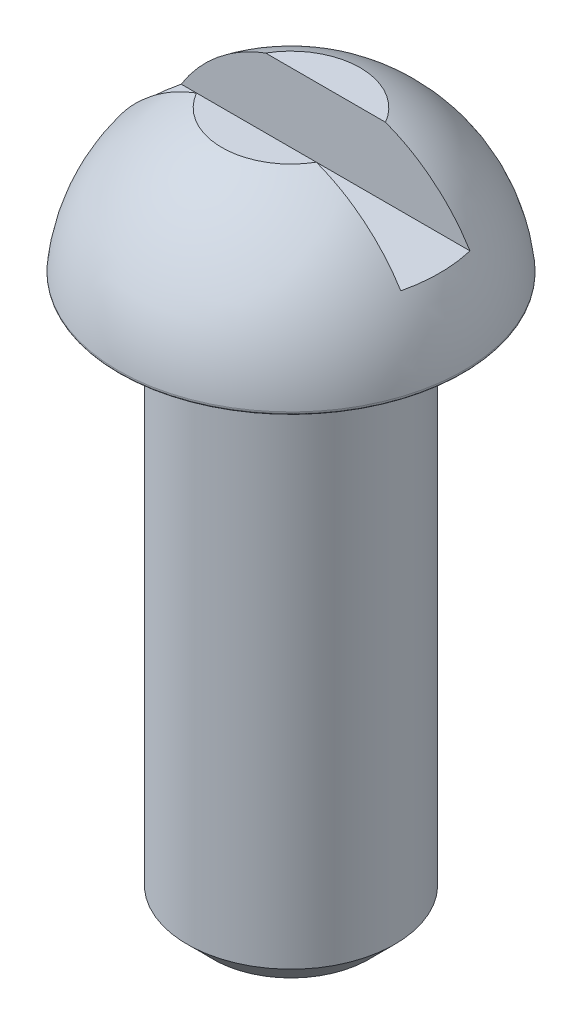
ISO-10303-21;
HEADER;
FILE_DESCRIPTION(('STEP AP214'),'2;1');
FILE_NAME('part.step','',(''),(''),'','','');
FILE_SCHEMA(('AUTOMOTIVE_DESIGN { 1 0 10303 214 1 1 1 1 }'));
ENDSEC;
DATA;
#1=APPLICATION_CONTEXT('core data for automotive mechanical design processes');
#2=APPLICATION_PROTOCOL_DEFINITION('international standard','automotive_design',2000,#1);
#3=PRODUCT_CONTEXT('',#1,'mechanical');
#4=PRODUCT('Part','Part','',(#3));
#5=PRODUCT_RELATED_PRODUCT_CATEGORY('part','',(#4));
#6=PRODUCT_DEFINITION_FORMATION('','',#4);
#7=PRODUCT_DEFINITION_CONTEXT('part definition',#1,'design');
#8=PRODUCT_DEFINITION('design','',#6,#7);
#9=PRODUCT_DEFINITION_SHAPE('','',#8);
#10=(LENGTH_UNIT() NAMED_UNIT(*) SI_UNIT(.MILLI.,.METRE.));
#11=(NAMED_UNIT(*) PLANE_ANGLE_UNIT() SI_UNIT($,.RADIAN.));
#12=(NAMED_UNIT(*) SI_UNIT($,.STERADIAN.) SOLID_ANGLE_UNIT());
#13=UNCERTAINTY_MEASURE_WITH_UNIT(LENGTH_MEASURE(1.E-05),#10,'distance_accuracy_value','');
#14=(GEOMETRIC_REPRESENTATION_CONTEXT(3) GLOBAL_UNCERTAINTY_ASSIGNED_CONTEXT((#13)) GLOBAL_UNIT_ASSIGNED_CONTEXT((#10,
#11,#12)) REPRESENTATION_CONTEXT('',''));
#15=CARTESIAN_POINT('',(0.,0.,0.));
#16=DIRECTION('',(0.,0.,1.));
#17=DIRECTION('',(1.,0.,0.));
#18=AXIS2_PLACEMENT_3D('',#15,#16,#17);
#19=CARTESIAN_POINT('',(0.,20.2,0.));
#20=DIRECTION('',(0.,1.,0.));
#21=DIRECTION('',(0.,0.,1.));
#22=AXIS2_PLACEMENT_3D('',#19,#20,#21);
#23=PLANE('',#22);
#24=DIRECTION('',(-1.,0.,0.));
#25=VECTOR('',#24,1.);
#26=CARTESIAN_POINT('',(-5.,20.2,-0.999999999999999));
#27=LINE('',#26,#25);
#28=CARTESIAN_POINT('',(1.73205080756887,20.2,-1.));
#29=VERTEX_POINT('',#28);
#30=CARTESIAN_POINT('',(-1.73205080756887,20.2,-1.));
#31=VERTEX_POINT('',#30);
#32=EDGE_CURVE('E83',#29,#31,#27,.T.);
#33=ORIENTED_EDGE('',*,*,#32,.F.);
#34=CARTESIAN_POINT('',(0.,20.2,0.));
#35=DIRECTION('',(0.,-1.,0.));
#36=DIRECTION('',(0.,0.,-1.));
#37=AXIS2_PLACEMENT_3D('',#34,#35,#36);
#38=CIRCLE('',#37,2.);
#39=EDGE_CURVE('E90',#31,#29,#38,.T.);
#40=ORIENTED_EDGE('',*,*,#39,.F.);
#41=EDGE_LOOP('',(#33,#40));
#42=FACE_BOUND('',#41,.T.);
#43=ADVANCED_FACE('F29',(#42),#23,.T.);
#44=CARTESIAN_POINT('',(2.25,0.,0.));
#45=DIRECTION('',(0.,-1.,0.));
#46=DIRECTION('',(0.,0.,-1.));
#47=AXIS2_PLACEMENT_3D('',#44,#45,#46);
#48=PLANE('',#47);
#49=CARTESIAN_POINT('',(0.,0.,0.));
#50=DIRECTION('',(0.,-1.,0.));
#51=DIRECTION('',(0.,0.,-1.));
#52=AXIS2_PLACEMENT_3D('',#49,#50,#51);
#53=CIRCLE('',#52,2.25);
#54=CARTESIAN_POINT('',(0.,0.,-2.25));
#55=VERTEX_POINT('',#54);
#56=EDGE_CURVE('E188',#55,#55,#53,.T.);
#57=ORIENTED_EDGE('',*,*,#56,.T.);
#58=EDGE_LOOP('',(#57));
#59=FACE_BOUND('',#58,.T.);
#60=ADVANCED_FACE('F31',(#59),#48,.T.);
#61=DIRECTION('',(1.,0.,0.));
#62=VECTOR('',#61,1.);
#63=CARTESIAN_POINT('',(-5.,20.2,1.));
#64=LINE('',#63,#62);
#65=CARTESIAN_POINT('',(-1.73205080756887,20.2,1.));
#66=VERTEX_POINT('',#65);
#67=CARTESIAN_POINT('',(1.73205080756887,20.2,1.));
#68=VERTEX_POINT('',#67);
#69=EDGE_CURVE('E74',#66,#68,#64,.T.);
#70=ORIENTED_EDGE('',*,*,#69,.F.);
#71=EDGE_CURVE('E82',#68,#66,#38,.T.);
#72=ORIENTED_EDGE('',*,*,#71,.F.);
#73=EDGE_LOOP('',(#70,#72));
#74=FACE_BOUND('',#73,.T.);
#75=ADVANCED_FACE('F81',(#74),#23,.T.);
#76=CARTESIAN_POINT('',(0.,15.6108342871665,0.));
#77=DIRECTION('',(0.,-1.,0.));
#78=DIRECTION('',(0.,0.,-1.));
#79=AXIS2_PLACEMENT_3D('',#76,#77,#78);
#80=DEGENERATE_TOROIDAL_SURFACE('',#79,0.0151680020330888,5.,.T.);
#81=CARTESIAN_POINT('',(0.,20.5128854839392,-1.));
#82=CARTESIAN_POINT('',(-0.169557181838723,20.5128939507586,-1.));
#83=CARTESIAN_POINT('',(-0.339026922754629,20.5042303683734,-1.));
#84=CARTESIAN_POINT('',(-0.676232944706972,20.469587223094,-1.));
#85=CARTESIAN_POINT('',(-0.843969405384313,20.443609473333,-1.));
#86=CARTESIAN_POINT('',(-1.14503973748901,20.3809247905035,-1.));
#87=CARTESIAN_POINT('',(-1.27898414052325,20.3471015058656,-1.));
#88=CARTESIAN_POINT('',(-1.54359706695251,20.2682883520842,-1.));
#89=CARTESIAN_POINT('',(-1.67426470696919,20.2232955066392,-1.));
#90=CARTESIAN_POINT('',(-1.93145983942588,20.1224070753553,-1.));
#91=CARTESIAN_POINT('',(-2.05798333215394,20.0665012991591,-1.));
#92=CARTESIAN_POINT('',(-2.30590425769781,19.9441838688712,-1.));
#93=CARTESIAN_POINT('',(-2.42729980449856,19.8777683912979,-1.));
#94=CARTESIAN_POINT('',(-2.66386390498333,19.7350265947615,-1.));
#95=CARTESIAN_POINT('',(-2.77904167957172,19.6587155564812,-1.));
#96=CARTESIAN_POINT('',(-3.00258835419661,19.4966162290059,-1.));
#97=CARTESIAN_POINT('',(-3.11095472221317,19.4108244478177,-1.));
#98=CARTESIAN_POINT('',(-3.31999237594499,19.2304540196594,-1.));
#99=CARTESIAN_POINT('',(-3.42066839029364,19.1358808527463,-1.));
#100=CARTESIAN_POINT('',(-3.61371665053473,18.9385398711822,-1.));
#101=CARTESIAN_POINT('',(-3.70608581867615,18.8357690456295,-1.));
#102=CARTESIAN_POINT('',(-3.88163317168832,18.6230211503068,-1.));
#103=CARTESIAN_POINT('',(-3.96483031591958,18.5130597238344,-1.));
#104=CARTESIAN_POINT('',(-4.12169406138961,18.2864768923303,-1.));
#105=CARTESIAN_POINT('',(-4.1953571374636,18.1698530467513,-0.999999999999999));
#106=CARTESIAN_POINT('',(-4.33256893955827,17.9308524743863,-0.999999999999999));
#107=CARTESIAN_POINT('',(-4.39612108050007,17.8084777081132,-0.999999999999999));
#108=CARTESIAN_POINT('',(-4.51271059823116,17.5587629351437,-0.999999999999999));
#109=CARTESIAN_POINT('',(-4.56574408518139,17.4314211123651,-0.999999999999999));
#110=CARTESIAN_POINT('',(-4.6608583502784,17.1728033461938,-0.999999999999999));
#111=CARTESIAN_POINT('',(-4.70294618264055,17.0415299977229,-0.999999999999999));
#112=CARTESIAN_POINT('',(-4.77592913831986,16.7758594613717,-0.999999999999999));
#113=CARTESIAN_POINT('',(-4.80682013734069,16.6414611417825,-0.999999999999999));
#114=CARTESIAN_POINT('',(-4.85715548691062,16.3705739781245,-0.999999999999999));
#115=CARTESIAN_POINT('',(-4.87660391886644,16.2340858972893,-0.999999999999999));
#116=CARTESIAN_POINT('',(-4.90395054997721,15.9599609614968,-0.999999999999999));
#117=CARTESIAN_POINT('',(-4.91184473045492,15.8223237235833,-0.999999999999999));
#118=CARTESIAN_POINT('',(-4.91802226356671,15.4091663106952,-0.999999999999999));
#119=CARTESIAN_POINT('',(-4.89885761237477,15.1330925616796,-0.999999999999999));
#120=CARTESIAN_POINT('',(-4.83565436742556,14.7247606185012,-0.999999999999999));
#121=CARTESIAN_POINT('',(-4.80882062296754,14.5895432156402,-0.999999999999999));
#122=CARTESIAN_POINT('',(-4.74386614429401,14.3218434819595,-0.999999999999999));
#123=CARTESIAN_POINT('',(-4.70574933648759,14.189360216811,-0.999999999999999));
#124=CARTESIAN_POINT('',(-4.61847741340263,13.9280431753018,-0.999999999999999));
#125=CARTESIAN_POINT('',(-4.56931842405602,13.7992106977012,-0.999999999999999));
#126=CARTESIAN_POINT('',(-4.4603405217531,13.5461885252266,-0.999999999999999));
#127=CARTESIAN_POINT('',(-4.40052553669696,13.4219971399397,-0.999999999999999));
#128=CARTESIAN_POINT('',(-4.27062373627063,13.1790482373327,-0.999999999999999));
#129=CARTESIAN_POINT('',(-4.20053303133169,13.0602928000644,-1.));
#130=CARTESIAN_POINT('',(-4.05062317272889,12.8291518799936,-1.));
#131=CARTESIAN_POINT('',(-3.97080761709885,12.7167640636875,-1.));
#132=CARTESIAN_POINT('',(-3.80195930460487,12.4990636255879,-1.));
#133=CARTESIAN_POINT('',(-3.71292266831044,12.3937540126641,-1.));
#134=CARTESIAN_POINT('',(-3.52632823913524,12.1910478547113,-1.));
#135=CARTESIAN_POINT('',(-3.42877360098011,12.0936484056547,-1.));
#136=CARTESIAN_POINT('',(-3.22577350395864,11.9073783771947,-1.));
#137=CARTESIAN_POINT('',(-3.12032532262769,11.8185107647473,-1.));
#138=CARTESIAN_POINT('',(-2.90235860909285,11.6500044279325,-1.));
#139=CARTESIAN_POINT('',(-2.78984269547053,11.5703623162766,-1.));
#140=CARTESIAN_POINT('',(-2.55843994385344,11.4207904872478,-1.));
#141=CARTESIAN_POINT('',(-2.43954952910377,11.3508663033697,-1.));
#142=CARTESIAN_POINT('',(-2.19634782163877,11.221301516354,-1.));
#143=CARTESIAN_POINT('',(-2.07203852883527,11.1616571588959,-1.));
#144=CARTESIAN_POINT('',(-1.81879741538759,11.0530196080779,-1.));
#145=CARTESIAN_POINT('',(-1.68986399240108,11.0040301491903,-1.));
#146=CARTESIAN_POINT('',(-1.42838328787876,10.9170806851824,-1.));
#147=CARTESIAN_POINT('',(-1.29583725312695,10.879116926302,-1.));
#148=CARTESIAN_POINT('',(-1.02784924149484,10.8144052964999,-1.));
#149=CARTESIAN_POINT('',(-0.892403899354292,10.7876712951932,-1.));
#150=CARTESIAN_POINT('',(-0.619801709020973,10.7456310895777,-1.));
#151=CARTESIAN_POINT('',(-0.482644833082197,10.7303250707755,-1.));
#152=CARTESIAN_POINT('',(-0.0699016829823774,10.7016403862007,-1.));
#153=CARTESIAN_POINT('',(0.207163974155286,10.7054455158317,-1.));
#154=CARTESIAN_POINT('',(0.620379379138504,10.7456631628354,-1.));
#155=CARTESIAN_POINT('',(0.758468614696078,10.7650229086626,-1.));
#156=CARTESIAN_POINT('',(1.03256411441096,10.8153713872689,-1.));
#157=CARTESIAN_POINT('',(1.16857038348469,10.8463600925958,-1.));
#158=CARTESIAN_POINT('',(1.43740687558279,10.9197667828583,-1.));
#159=CARTESIAN_POINT('',(1.57023800699988,10.9621814552151,-1.));
#160=CARTESIAN_POINT('',(1.83186170670424,11.0581700999038,-1.));
#161=CARTESIAN_POINT('',(1.96065286418965,11.1117479216928,-1.));
#162=CARTESIAN_POINT('',(2.21229233681948,11.2292468653342,-1.));
#163=CARTESIAN_POINT('',(2.33517686427824,11.293090464794,-1.));
#164=CARTESIAN_POINT('',(2.57515245823515,11.4309649502526,-1.));
#165=CARTESIAN_POINT('',(2.69224137702678,11.5049995749264,-1.));
#166=CARTESIAN_POINT('',(2.91969880763678,11.6626842026856,-1.));
#167=CARTESIAN_POINT('',(3.03006947507509,11.7463310964328,-1.));
#168=CARTESIAN_POINT('',(3.24337902106771,11.922694171776,-1.));
#169=CARTESIAN_POINT('',(3.34631514273422,12.0154136879857,-1.));
#170=CARTESIAN_POINT('',(3.5435342903974,12.2088030839127,-1.));
#171=CARTESIAN_POINT('',(3.63785352683289,12.3094360402058,-1.));
#172=CARTESIAN_POINT('',(3.81771019829952,12.5183302666773,-1.));
#173=CARTESIAN_POINT('',(3.90324438972962,12.6265943297004,-1.));
#174=CARTESIAN_POINT('',(4.06484937250135,12.8499025386276,-1.));
#175=CARTESIAN_POINT('',(4.14092395067599,12.9649439440969,-1.));
#176=CARTESIAN_POINT('',(4.2831346846115,13.2010716161025,-1.));
#177=CARTESIAN_POINT('',(4.34926716186651,13.322160098047,-1.));
#178=CARTESIAN_POINT('',(4.4710401913687,13.5693827725115,-1.));
#179=CARTESIAN_POINT('',(4.526689085618,13.6955128556138,-1.));
#180=CARTESIAN_POINT('',(4.62718349389348,13.9520569707438,-1.));
#181=CARTESIAN_POINT('',(4.67202501296511,14.082472566734,-1.));
#182=CARTESIAN_POINT('',(4.75054378634992,14.3465808741478,-1.));
#183=CARTESIAN_POINT('',(4.78422507811644,14.4802723816003,-1.));
#184=CARTESIAN_POINT('',(4.84022012367805,14.7500289801254,-1.));
#185=CARTESIAN_POINT('',(4.86252967611517,14.8860949292762,-1.));
#186=CARTESIAN_POINT('',(4.91208198208369,15.2962800803823,-1.));
#187=CARTESIAN_POINT('',(4.92204141540977,15.5727005568626,-1.));
#188=CARTESIAN_POINT('',(4.89539813305126,16.1231395236122,-1.));
#189=CARTESIAN_POINT('',(4.85879540943576,16.3971580134723,-1.));
#190=CARTESIAN_POINT('',(4.74010972492546,16.9351957443902,-1.));
#191=CARTESIAN_POINT('',(4.65802761149768,17.1992151716736,-1.));
#192=CARTESIAN_POINT('',(4.45070358586524,17.7097160239854,-1.));
#193=CARTESIAN_POINT('',(4.32546166169026,17.9561974441497,-1.));
#194=CARTESIAN_POINT('',(4.0353708543484,18.4246512364068,-1.));
#195=CARTESIAN_POINT('',(3.87052011467672,18.6466224589701,-1.));
#196=CARTESIAN_POINT('',(3.50590273785951,19.0597331988992,-1.));
#197=CARTESIAN_POINT('',(3.30613738081084,19.2508738461321,-1.));
#198=CARTESIAN_POINT('',(2.87735818710066,19.5969184625164,-1.));
#199=CARTESIAN_POINT('',(2.64834393429841,19.7518219160117,-1.));
#200=CARTESIAN_POINT('',(2.16751167269193,20.0210452383048,-1.));
#201=CARTESIAN_POINT('',(1.91568787167098,20.1353547622846,-1.));
#202=CARTESIAN_POINT('',(1.39078385021159,20.3221578239191,-1.));
#203=CARTESIAN_POINT('',(1.11735957991675,20.3936839141624,-1.));
#204=CARTESIAN_POINT('',(0.562537309292828,20.4890144144784,-1.));
#205=CARTESIAN_POINT('',(0.281148449311643,20.512871444822,-1.));
#206=CARTESIAN_POINT('',(0.,20.5128854839392,-1.));
#207=B_SPLINE_CURVE_WITH_KNOTS('',3,(#81,#82,#83,#84,#85,#86,#87,#88,#89,#90,#91,#92,#93,#94,
#95,#96,#97,#98,#99,#100,#101,#102,#103,#104,#105,#106,#107,#108,#109,#110,#111,#112,#113,#114,
#115,#116,#117,#118,#119,#120,#121,#122,#123,#124,#125,#126,#127,#128,#129,#130,#131,#132,#133,
#134,#135,#136,#137,#138,#139,#140,#141,#142,#143,#144,#145,#146,#147,#148,#149,#150,#151,#152,
#153,#154,#155,#156,#157,#158,#159,#160,#161,#162,#163,#164,#165,#166,#167,#168,#169,#170,#171,
#172,#173,#174,#175,#176,#177,#178,#179,#180,#181,#182,#183,#184,#185,#186,#187,#188,#189,#190,
#191,#192,#193,#194,#195,#196,#197,#198,#199,#200,#201,#202,#203,#204,#205,#206),.UNSPECIFIED.,
.T.,.F.,(4,2,2,2,2,2,2,2,2,2,2,2,2,2,2,2,2,2,2,2,2,2,2,2,2,2,2,2,2,2,2,2,2,2,2,2,2,2,2,2,2,2,2,
2,2,2,2,2,2,2,2,2,2,2,2,2,2,2,2,2,2,2,4),(0.,0.508303007015323,1.01655279309027,
1.43053511928803,1.84462787608033,2.25910917334688,2.67374160911585,3.08774123056177,
3.50189384982177,3.9157897306988,4.32983833680059,4.74301435305337,5.15634270488183,
5.5695311592685,5.9828721286181,6.39594604562871,6.80917196205232,7.22225039696367,
7.63547247032324,8.46098855709147,8.87418318086761,9.28723418516442,9.70043033234164,
10.1134744854944,10.5266753898605,10.9397238783276,11.3529468531714,11.7660174307608,
12.1792311377209,12.5922926425908,13.0055883939184,13.4187328831722,13.8320219443457,
14.245170133598,14.6588271029137,15.0724907868365,15.8991874518347,16.3171292348522,
16.7350700312501,17.1528897897835,17.5708538668281,17.9857983318554,18.400895430956,
18.8158586320898,19.2309749286601,19.6442577644289,20.0576926474273,20.4709614894003,
20.8843828635328,21.2974738672929,21.7107173370604,22.1238111434312,22.5370574593908,
23.3625800851533,24.1881028515267,25.0136102355526,25.8391178485319,26.6646641614291,
27.4901802131426,28.3157080112527,29.1414460333295,29.9852122160073,30.828046477895),.UNSPECIFIED.);
#208=CARTESIAN_POINT('',(-4.17447127817742,18.2,-0.999999999999999));
#209=VERTEX_POINT('',#208);
#210=EDGE_CURVE('E11',#31,#209,#207,.T.);
#211=ORIENTED_EDGE('',*,*,#210,.F.);
#212=ORIENTED_EDGE('',*,*,#39,.T.);
#213=CARTESIAN_POINT('',(4.17447127817742,18.2,-1.));
#214=VERTEX_POINT('',#213);
#215=EDGE_CURVE('E33',#214,#29,#207,.T.);
#216=ORIENTED_EDGE('',*,*,#215,.F.);
#217=CARTESIAN_POINT('',(0.,18.2,0.));
#218=DIRECTION('',(0.,1.,0.));
#219=DIRECTION('',(0.,0.,1.));
#220=AXIS2_PLACEMENT_3D('',#217,#218,#219);
#221=CIRCLE('',#220,4.2925762022739);
#222=CARTESIAN_POINT('',(4.17447127817742,18.2,0.999999999999999));
#223=VERTEX_POINT('',#222);
#224=EDGE_CURVE('E102',#214,#223,#221,.F.);
#225=ORIENTED_EDGE('',*,*,#224,.T.);
#226=CARTESIAN_POINT('',(0.,20.5128854839392,1.));
#227=CARTESIAN_POINT('',(0.169557181838723,20.5128939507586,1.));
#228=CARTESIAN_POINT('',(0.339026922754629,20.5042303683734,1.));
#229=CARTESIAN_POINT('',(0.676232944706972,20.469587223094,1.));
#230=CARTESIAN_POINT('',(0.843969405384313,20.443609473333,1.));
#231=CARTESIAN_POINT('',(1.14503973748901,20.3809247905035,1.));
#232=CARTESIAN_POINT('',(1.27898414052325,20.3471015058656,1.));
#233=CARTESIAN_POINT('',(1.54359706695251,20.2682883520842,1.));
#234=CARTESIAN_POINT('',(1.67426470696919,20.2232955066392,1.));
#235=CARTESIAN_POINT('',(1.93145983942588,20.1224070753553,1.));
#236=CARTESIAN_POINT('',(2.05798333215394,20.0665012991591,1.));
#237=CARTESIAN_POINT('',(2.30590425769781,19.9441838688712,1.));
#238=CARTESIAN_POINT('',(2.42729980449856,19.8777683912979,1.));
#239=CARTESIAN_POINT('',(2.66386390498333,19.7350265947615,1.));
#240=CARTESIAN_POINT('',(2.77904167957172,19.6587155564812,1.));
#241=CARTESIAN_POINT('',(3.00258835419661,19.4966162290059,1.));
#242=CARTESIAN_POINT('',(3.11095472221317,19.4108244478177,1.));
#243=CARTESIAN_POINT('',(3.31999237594499,19.2304540196594,1.));
#244=CARTESIAN_POINT('',(3.42066839029364,19.1358808527463,1.));
#245=CARTESIAN_POINT('',(3.61371665053473,18.9385398711822,1.));
#246=CARTESIAN_POINT('',(3.70608581867615,18.8357690456295,1.));
#247=CARTESIAN_POINT('',(3.88163317168832,18.6230211503068,1.));
#248=CARTESIAN_POINT('',(3.96483031591958,18.5130597238344,1.));
#249=CARTESIAN_POINT('',(4.12169406138961,18.2864768923303,1.));
#250=CARTESIAN_POINT('',(4.1953571374636,18.1698530467513,0.999999999999999));
#251=CARTESIAN_POINT('',(4.33256893955827,17.9308524743863,0.999999999999999));
#252=CARTESIAN_POINT('',(4.39612108050007,17.8084777081132,0.999999999999999));
#253=CARTESIAN_POINT('',(4.51271059823116,17.5587629351437,0.999999999999999));
#254=CARTESIAN_POINT('',(4.56574408518139,17.4314211123651,0.999999999999999));
#255=CARTESIAN_POINT('',(4.6608583502784,17.1728033461938,0.999999999999999));
#256=CARTESIAN_POINT('',(4.70294618264055,17.0415299977229,0.999999999999999));
#257=CARTESIAN_POINT('',(4.77592913831986,16.7758594613717,0.999999999999999));
#258=CARTESIAN_POINT('',(4.80682013734069,16.6414611417825,0.999999999999999));
#259=CARTESIAN_POINT('',(4.85715548691062,16.3705739781245,0.999999999999999));
#260=CARTESIAN_POINT('',(4.87660391886644,16.2340858972893,0.999999999999999));
#261=CARTESIAN_POINT('',(4.90395054997721,15.9599609614968,0.999999999999999));
#262=CARTESIAN_POINT('',(4.91184473045492,15.8223237235833,0.999999999999999));
#263=CARTESIAN_POINT('',(4.91802226356671,15.4091663106952,0.999999999999999));
#264=CARTESIAN_POINT('',(4.89885761237477,15.1330925616796,0.999999999999999));
#265=CARTESIAN_POINT('',(4.83565436742556,14.7247606185012,0.999999999999999));
#266=CARTESIAN_POINT('',(4.80882062296754,14.5895432156402,0.999999999999999));
#267=CARTESIAN_POINT('',(4.74386614429401,14.3218434819595,0.999999999999999));
#268=CARTESIAN_POINT('',(4.70574933648759,14.189360216811,0.999999999999999));
#269=CARTESIAN_POINT('',(4.61847741340263,13.9280431753018,0.999999999999999));
#270=CARTESIAN_POINT('',(4.56931842405602,13.7992106977012,0.999999999999999));
#271=CARTESIAN_POINT('',(4.4603405217531,13.5461885252266,0.999999999999999));
#272=CARTESIAN_POINT('',(4.40052553669696,13.4219971399397,0.999999999999999));
#273=CARTESIAN_POINT('',(4.27062373627063,13.1790482373327,0.999999999999999));
#274=CARTESIAN_POINT('',(4.20053303133169,13.0602928000644,1.));
#275=CARTESIAN_POINT('',(4.05062317272889,12.8291518799936,1.));
#276=CARTESIAN_POINT('',(3.97080761709885,12.7167640636875,1.));
#277=CARTESIAN_POINT('',(3.80195930460487,12.4990636255879,1.));
#278=CARTESIAN_POINT('',(3.71292266831044,12.3937540126641,1.));
#279=CARTESIAN_POINT('',(3.52632823913524,12.1910478547113,1.));
#280=CARTESIAN_POINT('',(3.42877360098011,12.0936484056547,1.));
#281=CARTESIAN_POINT('',(3.22577350395864,11.9073783771947,1.));
#282=CARTESIAN_POINT('',(3.12032532262769,11.8185107647473,1.));
#283=CARTESIAN_POINT('',(2.90235860909285,11.6500044279325,1.));
#284=CARTESIAN_POINT('',(2.78984269547053,11.5703623162766,1.));
#285=CARTESIAN_POINT('',(2.55843994385344,11.4207904872478,1.));
#286=CARTESIAN_POINT('',(2.43954952910377,11.3508663033697,1.));
#287=CARTESIAN_POINT('',(2.19634782163877,11.221301516354,1.));
#288=CARTESIAN_POINT('',(2.07203852883527,11.1616571588959,1.));
#289=CARTESIAN_POINT('',(1.81879741538759,11.0530196080779,1.));
#290=CARTESIAN_POINT('',(1.68986399240108,11.0040301491903,1.));
#291=CARTESIAN_POINT('',(1.42838328787876,10.9170806851824,1.));
#292=CARTESIAN_POINT('',(1.29583725312695,10.879116926302,1.));
#293=CARTESIAN_POINT('',(1.02784924149484,10.8144052964999,1.));
#294=CARTESIAN_POINT('',(0.892403899354292,10.7876712951932,1.));
#295=CARTESIAN_POINT('',(0.619801709020973,10.7456310895777,1.));
#296=CARTESIAN_POINT('',(0.482644833082197,10.7303250707755,1.));
#297=CARTESIAN_POINT('',(0.0699016829823774,10.7016403862007,1.));
#298=CARTESIAN_POINT('',(-0.207163974155286,10.7054455158317,1.));
#299=CARTESIAN_POINT('',(-0.620379379138504,10.7456631628354,1.));
#300=CARTESIAN_POINT('',(-0.758468614696078,10.7650229086626,1.));
#301=CARTESIAN_POINT('',(-1.03256411441096,10.8153713872689,1.));
#302=CARTESIAN_POINT('',(-1.16857038348469,10.8463600925958,1.));
#303=CARTESIAN_POINT('',(-1.43740687558279,10.9197667828583,1.));
#304=CARTESIAN_POINT('',(-1.57023800699988,10.9621814552151,1.));
#305=CARTESIAN_POINT('',(-1.83186170670424,11.0581700999038,1.));
#306=CARTESIAN_POINT('',(-1.96065286418965,11.1117479216928,1.));
#307=CARTESIAN_POINT('',(-2.21229233681948,11.2292468653342,1.));
#308=CARTESIAN_POINT('',(-2.33517686427824,11.293090464794,1.));
#309=CARTESIAN_POINT('',(-2.57515245823515,11.4309649502526,1.));
#310=CARTESIAN_POINT('',(-2.69224137702678,11.5049995749264,1.));
#311=CARTESIAN_POINT('',(-2.91969880763678,11.6626842026856,1.));
#312=CARTESIAN_POINT('',(-3.03006947507509,11.7463310964328,1.));
#313=CARTESIAN_POINT('',(-3.24337902106771,11.922694171776,1.));
#314=CARTESIAN_POINT('',(-3.34631514273422,12.0154136879857,1.));
#315=CARTESIAN_POINT('',(-3.5435342903974,12.2088030839127,1.));
#316=CARTESIAN_POINT('',(-3.63785352683289,12.3094360402058,1.));
#317=CARTESIAN_POINT('',(-3.81771019829952,12.5183302666773,1.));
#318=CARTESIAN_POINT('',(-3.90324438972962,12.6265943297004,1.));
#319=CARTESIAN_POINT('',(-4.06484937250135,12.8499025386276,1.));
#320=CARTESIAN_POINT('',(-4.14092395067599,12.9649439440969,1.));
#321=CARTESIAN_POINT('',(-4.2831346846115,13.2010716161025,1.));
#322=CARTESIAN_POINT('',(-4.34926716186651,13.322160098047,1.));
#323=CARTESIAN_POINT('',(-4.4710401913687,13.5693827725115,1.));
#324=CARTESIAN_POINT('',(-4.526689085618,13.6955128556138,1.));
#325=CARTESIAN_POINT('',(-4.62718349389348,13.9520569707438,1.));
#326=CARTESIAN_POINT('',(-4.67202501296511,14.082472566734,1.));
#327=CARTESIAN_POINT('',(-4.75054378634992,14.3465808741478,1.));
#328=CARTESIAN_POINT('',(-4.78422507811644,14.4802723816003,1.));
#329=CARTESIAN_POINT('',(-4.84022012367805,14.7500289801254,1.));
#330=CARTESIAN_POINT('',(-4.86252967611517,14.8860949292762,1.));
#331=CARTESIAN_POINT('',(-4.91208198208369,15.2962800803823,1.));
#332=CARTESIAN_POINT('',(-4.92204141540977,15.5727005568626,1.));
#333=CARTESIAN_POINT('',(-4.89539813305126,16.1231395236122,1.));
#334=CARTESIAN_POINT('',(-4.85879540943576,16.3971580134723,1.));
#335=CARTESIAN_POINT('',(-4.74010972492546,16.9351957443902,1.));
#336=CARTESIAN_POINT('',(-4.65802761149768,17.1992151716736,1.));
#337=CARTESIAN_POINT('',(-4.45070358586524,17.7097160239854,1.));
#338=CARTESIAN_POINT('',(-4.32546166169026,17.9561974441497,1.));
#339=CARTESIAN_POINT('',(-4.0353708543484,18.4246512364068,1.));
#340=CARTESIAN_POINT('',(-3.87052011467672,18.6466224589701,1.));
#341=CARTESIAN_POINT('',(-3.50590273785951,19.0597331988992,1.));
#342=CARTESIAN_POINT('',(-3.30613738081084,19.2508738461321,1.));
#343=CARTESIAN_POINT('',(-2.87735818710066,19.5969184625164,1.));
#344=CARTESIAN_POINT('',(-2.64834393429841,19.7518219160117,1.));
#345=CARTESIAN_POINT('',(-2.16751167269193,20.0210452383048,1.));
#346=CARTESIAN_POINT('',(-1.91568787167098,20.1353547622846,1.));
#347=CARTESIAN_POINT('',(-1.39078385021159,20.3221578239191,1.));
#348=CARTESIAN_POINT('',(-1.11735957991675,20.3936839141624,1.));
#349=CARTESIAN_POINT('',(-0.562537309292828,20.4890144144784,1.));
#350=CARTESIAN_POINT('',(-0.281148449311643,20.512871444822,1.));
#351=CARTESIAN_POINT('',(0.,20.5128854839392,1.));
#352=B_SPLINE_CURVE_WITH_KNOTS('',3,(#226,#227,#228,#229,#230,#231,#232,#233,#234,#235,#236,
#237,#238,#239,#240,#241,#242,#243,#244,#245,#246,#247,#248,#249,#250,#251,#252,#253,#254,#255,
#256,#257,#258,#259,#260,#261,#262,#263,#264,#265,#266,#267,#268,#269,#270,#271,#272,#273,#274,
#275,#276,#277,#278,#279,#280,#281,#282,#283,#284,#285,#286,#287,#288,#289,#290,#291,#292,#293,
#294,#295,#296,#297,#298,#299,#300,#301,#302,#303,#304,#305,#306,#307,#308,#309,#310,#311,#312,
#313,#314,#315,#316,#317,#318,#319,#320,#321,#322,#323,#324,#325,#326,#327,#328,#329,#330,#331,
#332,#333,#334,#335,#336,#337,#338,#339,#340,#341,#342,#343,#344,#345,#346,#347,#348,#349,#350,
#351),.UNSPECIFIED.,.T.,.F.,(4,2,2,2,2,2,2,2,2,2,2,2,2,2,2,2,2,2,2,2,2,2,2,2,2,2,2,2,2,2,2,2,2,
2,2,2,2,2,2,2,2,2,2,2,2,2,2,2,2,2,2,2,2,2,2,2,2,2,2,2,2,2,4),(0.,0.508303007015323,
1.01655279309027,1.43053511928803,1.84462787608033,2.25910917334688,2.67374160911585,
3.08774123056177,3.50189384982177,3.9157897306988,4.32983833680059,4.74301435305337,
5.15634270488183,5.5695311592685,5.9828721286181,6.39594604562871,6.80917196205232,
7.22225039696367,7.63547247032324,8.46098855709147,8.87418318086761,9.28723418516442,
9.70043033234164,10.1134744854944,10.5266753898605,10.9397238783276,11.3529468531714,
11.7660174307608,12.1792311377209,12.5922926425908,13.0055883939184,13.4187328831722,
13.8320219443457,14.245170133598,14.6588271029137,15.0724907868365,15.8991874518347,
16.3171292348522,16.7350700312501,17.1528897897835,17.5708538668281,17.9857983318554,
18.400895430956,18.8158586320898,19.2309749286601,19.6442577644289,20.0576926474273,
20.4709614894003,20.8843828635328,21.2974738672929,21.7107173370604,22.1238111434312,
22.5370574593908,23.3625800851533,24.1881028515267,25.0136102355526,25.8391178485319,
26.6646641614291,27.4901802131426,28.3157080112527,29.1414460333295,29.9852122160073,
30.828046477895),.UNSPECIFIED.);
#353=EDGE_CURVE('E78',#68,#223,#352,.T.);
#354=ORIENTED_EDGE('',*,*,#353,.F.);
#355=ORIENTED_EDGE('',*,*,#71,.T.);
#356=CARTESIAN_POINT('',(-4.17447127817742,18.2,1.));
#357=VERTEX_POINT('',#356);
#358=EDGE_CURVE('E42',#357,#66,#352,.T.);
#359=ORIENTED_EDGE('',*,*,#358,.F.);
#360=EDGE_CURVE('E54',#357,#209,#221,.F.);
#361=ORIENTED_EDGE('',*,*,#360,.T.);
#362=EDGE_LOOP('',(#211,#212,#216,#225,#354,#355,#359,#361));
#363=FACE_BOUND('',#362,.T.);
#364=CARTESIAN_POINT('',(0.,16.1099829737313,0.));
#365=DIRECTION('',(0.,-1.,0.));
#366=DIRECTION('',(0.,0.,-1.));
#367=AXIS2_PLACEMENT_3D('',#364,#365,#366);
#368=CIRCLE('',#367,4.99019067421264);
#369=CARTESIAN_POINT('',(0.,16.1099829737313,-4.99019067421264));
#370=VERTEX_POINT('',#369);
#371=EDGE_CURVE('E93',#370,#370,#368,.F.);
#372=ORIENTED_EDGE('',*,*,#371,.T.);
#373=EDGE_LOOP('',(#372));
#374=FACE_BOUND('',#373,.T.);
#375=ADVANCED_FACE('F86',(#363,#374),#80,.T.);
#376=CARTESIAN_POINT('',(5.,16.,0.));
#377=DIRECTION('',(0.,-1.,0.));
#378=DIRECTION('',(0.,0.,-1.));
#379=AXIS2_PLACEMENT_3D('',#376,#377,#378);
#380=PLANE('',#379);
#381=CARTESIAN_POINT('',(0.,16.,0.));
#382=DIRECTION('',(0.,-1.,0.));
#383=DIRECTION('',(0.,0.,-1.));
#384=AXIS2_PLACEMENT_3D('',#381,#382,#383);
#385=CIRCLE('',#384,4.89069022076906);
#386=CARTESIAN_POINT('',(0.,16.,-4.89069022076906));
#387=VERTEX_POINT('',#386);
#388=EDGE_CURVE('E89',#387,#387,#385,.T.);
#389=ORIENTED_EDGE('',*,*,#388,.T.);
#390=EDGE_LOOP('',(#389));
#391=FACE_BOUND('',#390,.T.);
#392=CARTESIAN_POINT('',(0.,16.,0.));
#393=DIRECTION('',(0.,-1.,0.));
#394=DIRECTION('',(0.,0.,-1.));
#395=AXIS2_PLACEMENT_3D('',#392,#393,#394);
#396=CIRCLE('',#395,3.);
#397=CARTESIAN_POINT('',(0.,16.,-3.));
#398=VERTEX_POINT('',#397);
#399=EDGE_CURVE('E96',#398,#398,#396,.T.);
#400=ORIENTED_EDGE('',*,*,#399,.F.);
#401=EDGE_LOOP('',(#400));
#402=FACE_BOUND('',#401,.T.);
#403=ADVANCED_FACE('F125',(#391,#402),#380,.T.);
#404=CARTESIAN_POINT('',(0.,0.,0.));
#405=DIRECTION('',(0.,-1.,0.));
#406=DIRECTION('',(0.,0.,-1.));
#407=AXIS2_PLACEMENT_3D('',#404,#405,#406);
#408=CYLINDRICAL_SURFACE('',#407,3.);
#409=ORIENTED_EDGE('',*,*,#399,.T.);
#410=EDGE_LOOP('',(#409));
#411=FACE_BOUND('',#410,.T.);
#412=CARTESIAN_POINT('',(0.,0.750000000000005,0.));
#413=DIRECTION('',(0.,-1.,0.));
#414=DIRECTION('',(0.,0.,-1.));
#415=AXIS2_PLACEMENT_3D('',#412,#413,#414);
#416=CIRCLE('',#415,3.);
#417=CARTESIAN_POINT('',(0.,0.750000000000005,-3.));
#418=VERTEX_POINT('',#417);
#419=EDGE_CURVE('E194',#418,#418,#416,.T.);
#420=ORIENTED_EDGE('',*,*,#419,.F.);
#421=EDGE_LOOP('',(#420));
#422=FACE_BOUND('',#421,.T.);
#423=ADVANCED_FACE('F122',(#411,#422),#408,.T.);
#424=CARTESIAN_POINT('',(0.,0.,0.));
#425=DIRECTION('',(0.,1.,0.));
#426=DIRECTION('',(0.,0.,1.));
#427=AXIS2_PLACEMENT_3D('',#424,#425,#426);
#428=CONICAL_SURFACE('',#427,2.25,0.785398163397445);
#429=ORIENTED_EDGE('',*,*,#419,.T.);
#430=EDGE_LOOP('',(#429));
#431=FACE_BOUND('',#430,.T.);
#432=ORIENTED_EDGE('',*,*,#56,.F.);
#433=EDGE_LOOP('',(#432));
#434=FACE_BOUND('',#433,.T.);
#435=ADVANCED_FACE('F118',(#431,#434),#428,.T.);
#436=CARTESIAN_POINT('',(0.,16.1,0.));
#437=DIRECTION('',(0.,-1.,0.));
#438=DIRECTION('',(0.,0.,-1.));
#439=AXIS2_PLACEMENT_3D('',#436,#437,#438);
#440=TOROIDAL_SURFACE('',#439,4.89069022076906,0.1);
#441=ORIENTED_EDGE('',*,*,#371,.F.);
#442=EDGE_LOOP('',(#441));
#443=FACE_BOUND('',#442,.T.);
#444=ORIENTED_EDGE('',*,*,#388,.F.);
#445=EDGE_LOOP('',(#444));
#446=FACE_BOUND('',#445,.T.);
#447=ADVANCED_FACE('F115',(#443,#446),#440,.T.);
#448=CARTESIAN_POINT('',(-5.,18.2,-0.999999999999999));
#449=DIRECTION('',(0.,0.,-1.));
#450=DIRECTION('',(-1.,0.,0.));
#451=AXIS2_PLACEMENT_3D('',#448,#449,#450);
#452=PLANE('',#451);
#453=ORIENTED_EDGE('',*,*,#210,.T.);
#454=DIRECTION('',(-1.,0.,0.));
#455=VECTOR('',#454,1.);
#456=CARTESIAN_POINT('',(-5.,18.2,-0.999999999999999));
#457=LINE('',#456,#455);
#458=EDGE_CURVE('E185',#214,#209,#457,.T.);
#459=ORIENTED_EDGE('',*,*,#458,.F.);
#460=ORIENTED_EDGE('',*,*,#215,.T.);
#461=ORIENTED_EDGE('',*,*,#32,.T.);
#462=EDGE_LOOP('',(#453,#459,#460,#461));
#463=FACE_BOUND('',#462,.T.);
#464=ADVANCED_FACE('F112',(#463),#452,.F.);
#465=CARTESIAN_POINT('',(-5.,18.2,1.));
#466=DIRECTION('',(0.,0.,1.));
#467=DIRECTION('',(1.,0.,0.));
#468=AXIS2_PLACEMENT_3D('',#465,#466,#467);
#469=PLANE('',#468);
#470=ORIENTED_EDGE('',*,*,#353,.T.);
#471=DIRECTION('',(1.,0.,0.));
#472=VECTOR('',#471,1.);
#473=CARTESIAN_POINT('',(-5.,18.2,1.));
#474=LINE('',#473,#472);
#475=EDGE_CURVE('E49',#357,#223,#474,.T.);
#476=ORIENTED_EDGE('',*,*,#475,.F.);
#477=ORIENTED_EDGE('',*,*,#358,.T.);
#478=ORIENTED_EDGE('',*,*,#69,.T.);
#479=EDGE_LOOP('',(#470,#476,#477,#478));
#480=FACE_BOUND('',#479,.T.);
#481=ADVANCED_FACE('F73',(#480),#469,.F.);
#482=CARTESIAN_POINT('',(-5.,18.2,1.));
#483=DIRECTION('',(0.,1.,0.));
#484=DIRECTION('',(0.,0.,1.));
#485=AXIS2_PLACEMENT_3D('',#482,#483,#484);
#486=PLANE('',#485);
#487=ORIENTED_EDGE('',*,*,#475,.T.);
#488=ORIENTED_EDGE('',*,*,#224,.F.);
#489=ORIENTED_EDGE('',*,*,#458,.T.);
#490=ORIENTED_EDGE('',*,*,#360,.F.);
#491=EDGE_LOOP('',(#487,#488,#489,#490));
#492=FACE_BOUND('',#491,.T.);
#493=ADVANCED_FACE('F111',(#492),#486,.T.);
#494=CLOSED_SHELL('',(#43,#60,#75,#375,#403,#423,#435,#447,#464,#481,#493));
#495=MANIFOLD_SOLID_BREP('B2',#494);
#496=ADVANCED_BREP_SHAPE_REPRESENTATION('',(#18,#495),#14);
#497=SHAPE_DEFINITION_REPRESENTATION(#9,#496);
ENDSEC;
END-ISO-10303-21;
